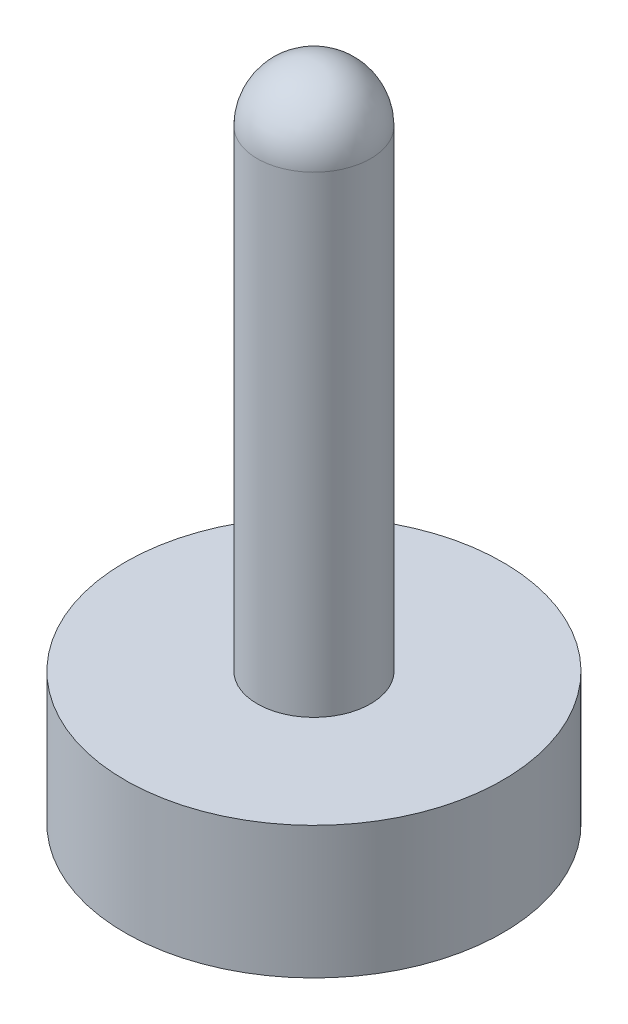
ISO-10303-21;
HEADER;
FILE_DESCRIPTION(('STEP AP214'),'2;1');
FILE_NAME('part.step','',(''),(''),'','','');
FILE_SCHEMA(('AUTOMOTIVE_DESIGN { 1 0 10303 214 1 1 1 1 }'));
ENDSEC;
DATA;
#1=APPLICATION_CONTEXT('core data for automotive mechanical design processes');
#2=APPLICATION_PROTOCOL_DEFINITION('international standard','automotive_design',2000,#1);
#3=PRODUCT_CONTEXT('',#1,'mechanical');
#4=PRODUCT('Part','Part','',(#3));
#5=PRODUCT_RELATED_PRODUCT_CATEGORY('part','',(#4));
#6=PRODUCT_DEFINITION_FORMATION('','',#4);
#7=PRODUCT_DEFINITION_CONTEXT('part definition',#1,'design');
#8=PRODUCT_DEFINITION('design','',#6,#7);
#9=PRODUCT_DEFINITION_SHAPE('','',#8);
#10=(LENGTH_UNIT() NAMED_UNIT(*) SI_UNIT(.MILLI.,.METRE.));
#11=(NAMED_UNIT(*) PLANE_ANGLE_UNIT() SI_UNIT($,.RADIAN.));
#12=(NAMED_UNIT(*) SI_UNIT($,.STERADIAN.) SOLID_ANGLE_UNIT());
#13=UNCERTAINTY_MEASURE_WITH_UNIT(LENGTH_MEASURE(1.E-05),#10,'distance_accuracy_value','');
#14=(GEOMETRIC_REPRESENTATION_CONTEXT(3) GLOBAL_UNCERTAINTY_ASSIGNED_CONTEXT((#13)) GLOBAL_UNIT_ASSIGNED_CONTEXT((#10,
#11,#12)) REPRESENTATION_CONTEXT('',''));
#15=CARTESIAN_POINT('',(0.,0.,0.));
#16=DIRECTION('',(0.,0.,1.));
#17=DIRECTION('',(1.,0.,0.));
#18=AXIS2_PLACEMENT_3D('',#15,#16,#17);
#19=CARTESIAN_POINT('',(0.,0.,0.));
#20=DIRECTION('',(0.,1.,0.));
#21=DIRECTION('',(-1.,0.,0.));
#22=AXIS2_PLACEMENT_3D('',#19,#20,#21);
#23=PLANE('',#22);
#24=CARTESIAN_POINT('',(0.,0.,0.));
#25=DIRECTION('',(0.,1.,0.));
#26=DIRECTION('',(-1.,0.,0.));
#27=AXIS2_PLACEMENT_3D('',#24,#25,#26);
#28=CIRCLE('',#27,2.);
#29=CARTESIAN_POINT('',(-2.,0.,0.));
#30=VERTEX_POINT('',#29);
#31=EDGE_CURVE('E10',#30,#30,#28,.T.);
#32=ORIENTED_EDGE('',*,*,#31,.F.);
#33=EDGE_LOOP('',(#32));
#34=FACE_BOUND('',#33,.T.);
#35=ADVANCED_FACE('F39',(#34),#23,.F.);
#36=CARTESIAN_POINT('',(0.,6.4,0.));
#37=DIRECTION('',(0.,1.,0.));
#38=DIRECTION('',(-1.,0.,0.));
#39=AXIS2_PLACEMENT_3D('',#36,#37,#38);
#40=CYLINDRICAL_SURFACE('',#39,2.);
#41=CARTESIAN_POINT('',(0.,1.4,0.));
#42=DIRECTION('',(0.,1.,0.));
#43=DIRECTION('',(-1.,0.,0.));
#44=AXIS2_PLACEMENT_3D('',#41,#42,#43);
#45=CIRCLE('',#44,2.);
#46=CARTESIAN_POINT('',(-2.,1.4,0.));
#47=VERTEX_POINT('',#46);
#48=EDGE_CURVE('E47',#47,#47,#45,.T.);
#49=ORIENTED_EDGE('',*,*,#48,.F.);
#50=EDGE_LOOP('',(#49));
#51=FACE_BOUND('',#50,.T.);
#52=ORIENTED_EDGE('',*,*,#31,.T.);
#53=EDGE_LOOP('',(#52));
#54=FACE_BOUND('',#53,.T.);
#55=ADVANCED_FACE('F69',(#51,#54),#40,.T.);
#56=CARTESIAN_POINT('',(2.,1.4,0.));
#57=DIRECTION('',(0.,-1.,0.));
#58=DIRECTION('',(1.,0.,0.));
#59=AXIS2_PLACEMENT_3D('',#56,#57,#58);
#60=PLANE('',#59);
#61=CARTESIAN_POINT('',(0.,1.4,0.));
#62=DIRECTION('',(0.,1.,0.));
#63=DIRECTION('',(-1.,0.,0.));
#64=AXIS2_PLACEMENT_3D('',#61,#62,#63);
#65=CIRCLE('',#64,0.6);
#66=CARTESIAN_POINT('',(-0.6,1.4,0.));
#67=VERTEX_POINT('',#66);
#68=EDGE_CURVE('E51',#67,#67,#65,.T.);
#69=ORIENTED_EDGE('',*,*,#68,.F.);
#70=EDGE_LOOP('',(#69));
#71=FACE_BOUND('',#70,.T.);
#72=ORIENTED_EDGE('',*,*,#48,.T.);
#73=EDGE_LOOP('',(#72));
#74=FACE_BOUND('',#73,.T.);
#75=ADVANCED_FACE('F63',(#71,#74),#60,.F.);
#76=CARTESIAN_POINT('',(0.,6.4,0.));
#77=DIRECTION('',(0.,1.,0.));
#78=DIRECTION('',(-1.,0.,0.));
#79=AXIS2_PLACEMENT_3D('',#76,#77,#78);
#80=CYLINDRICAL_SURFACE('',#79,0.6);
#81=CARTESIAN_POINT('',(0.,6.4,0.));
#82=DIRECTION('',(0.,1.,0.));
#83=DIRECTION('',(-1.,0.,0.));
#84=AXIS2_PLACEMENT_3D('',#81,#82,#83);
#85=CIRCLE('',#84,0.600000000000001);
#86=CARTESIAN_POINT('',(-0.600000000000001,6.4,0.));
#87=VERTEX_POINT('',#86);
#88=EDGE_CURVE('E43',#87,#87,#85,.T.);
#89=ORIENTED_EDGE('',*,*,#88,.F.);
#90=EDGE_LOOP('',(#89));
#91=FACE_BOUND('',#90,.T.);
#92=ORIENTED_EDGE('',*,*,#68,.T.);
#93=EDGE_LOOP('',(#92));
#94=FACE_BOUND('',#93,.T.);
#95=ADVANCED_FACE('F61',(#91,#94),#80,.T.);
#96=CARTESIAN_POINT('',(0.,6.4,0.));
#97=DIRECTION('',(0.,0.,1.));
#98=DIRECTION('',(1.,0.,0.));
#99=AXIS2_PLACEMENT_3D('',#96,#97,#98);
#100=SPHERICAL_SURFACE('',#99,0.600000000000001);
#101=CARTESIAN_POINT('',(0.,6.4,0.));
#102=DIRECTION('',(0.,1.,0.));
#103=DIRECTION('',(-1.,0.,0.));
#104=AXIS2_PLACEMENT_3D('',#101,#102,#103);
#105=SPHERICAL_SURFACE('',#104,0.600000000000001);
#106=ORIENTED_EDGE('',*,*,#88,.T.);
#107=EDGE_LOOP('',(#106));
#108=FACE_BOUND('',#107,.T.);
#109=ADVANCED_FACE('F41',(#108),#105,.T.);
#110=CLOSED_SHELL('',(#35,#55,#75,#95,#109));
#111=MANIFOLD_SOLID_BREP('B2',#110);
#112=ADVANCED_BREP_SHAPE_REPRESENTATION('',(#18,#111),#14);
#113=SHAPE_DEFINITION_REPRESENTATION(#9,#112);
ENDSEC;
END-ISO-10303-21;
